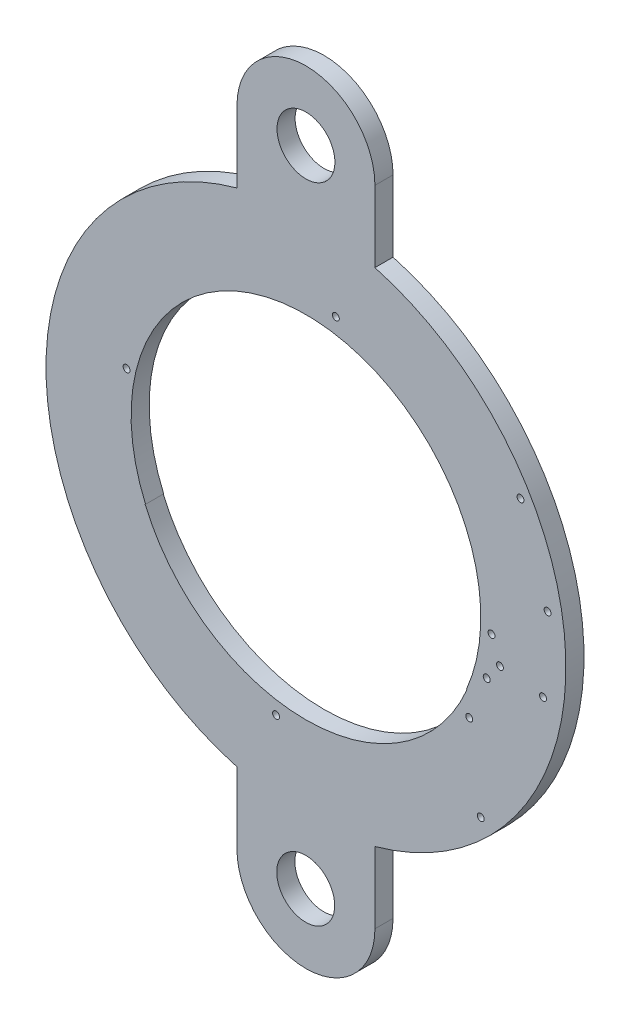
ISO-10303-21;
HEADER;
FILE_DESCRIPTION(('STEP AP214'),'2;1');
FILE_NAME('part.step','',(''),(''),'','','');
FILE_SCHEMA(('AUTOMOTIVE_DESIGN { 1 0 10303 214 1 1 1 1 }'));
ENDSEC;
DATA;
#1=APPLICATION_CONTEXT('core data for automotive mechanical design processes');
#2=APPLICATION_PROTOCOL_DEFINITION('international standard','automotive_design',2000,#1);
#3=PRODUCT_CONTEXT('',#1,'mechanical');
#4=PRODUCT('Part','Part','',(#3));
#5=PRODUCT_RELATED_PRODUCT_CATEGORY('part','',(#4));
#6=PRODUCT_DEFINITION_FORMATION('','',#4);
#7=PRODUCT_DEFINITION_CONTEXT('part definition',#1,'design');
#8=PRODUCT_DEFINITION('design','',#6,#7);
#9=PRODUCT_DEFINITION_SHAPE('','',#8);
#10=(LENGTH_UNIT() NAMED_UNIT(*) SI_UNIT(.MILLI.,.METRE.));
#11=(NAMED_UNIT(*) PLANE_ANGLE_UNIT() SI_UNIT($,.RADIAN.));
#12=(NAMED_UNIT(*) SI_UNIT($,.STERADIAN.) SOLID_ANGLE_UNIT());
#13=UNCERTAINTY_MEASURE_WITH_UNIT(LENGTH_MEASURE(1.E-05),#10,'distance_accuracy_value','');
#14=(GEOMETRIC_REPRESENTATION_CONTEXT(3) GLOBAL_UNCERTAINTY_ASSIGNED_CONTEXT((#13)) GLOBAL_UNIT_ASSIGNED_CONTEXT((#10,
#11,#12)) REPRESENTATION_CONTEXT('',''));
#15=CARTESIAN_POINT('',(0.,0.,0.));
#16=DIRECTION('',(0.,0.,1.));
#17=DIRECTION('',(1.,0.,0.));
#18=AXIS2_PLACEMENT_3D('',#15,#16,#17);
#19=CARTESIAN_POINT('',(0.,17.74358112,-0.285));
#20=DIRECTION('',(0.,0.,1.));
#21=DIRECTION('',(1.,0.,0.));
#22=AXIS2_PLACEMENT_3D('',#19,#20,#21);
#23=CYLINDRICAL_SURFACE('',#22,1.6);
#24=CARTESIAN_POINT('',(0.,17.74358112,1.));
#25=DIRECTION('',(0.,0.,-1.));
#26=DIRECTION('',(1.,0.,0.));
#27=AXIS2_PLACEMENT_3D('',#24,#25,#26);
#28=CIRCLE('',#27,1.6);
#29=CARTESIAN_POINT('',(1.6,17.74358112,1.));
#30=VERTEX_POINT('',#29);
#31=EDGE_CURVE('E625',#30,#30,#28,.T.);
#32=ORIENTED_EDGE('',*,*,#31,.F.);
#33=EDGE_LOOP('',(#32));
#34=FACE_BOUND('',#33,.T.);
#35=CARTESIAN_POINT('',(0.,17.74358112,0.));
#36=DIRECTION('',(0.,0.,1.));
#37=DIRECTION('',(1.,0.,0.));
#38=AXIS2_PLACEMENT_3D('',#35,#36,#37);
#39=CIRCLE('',#38,1.6);
#40=CARTESIAN_POINT('',(1.6,17.74358112,0.));
#41=VERTEX_POINT('',#40);
#42=EDGE_CURVE('E460',#41,#41,#39,.T.);
#43=ORIENTED_EDGE('',*,*,#42,.F.);
#44=EDGE_LOOP('',(#43));
#45=FACE_BOUND('',#44,.T.);
#46=ADVANCED_FACE('F331',(#34,#45),#23,.F.);
#47=CARTESIAN_POINT('',(10.715,-1.80141888,-0.285));
#48=DIRECTION('',(0.,0.,1.));
#49=DIRECTION('',(1.,0.,0.));
#50=AXIS2_PLACEMENT_3D('',#47,#48,#49);
#51=CYLINDRICAL_SURFACE('',#50,0.1905);
#52=CARTESIAN_POINT('',(10.715,-1.80141888,1.));
#53=DIRECTION('',(0.,0.,-1.));
#54=DIRECTION('',(1.,0.,0.));
#55=AXIS2_PLACEMENT_3D('',#52,#53,#54);
#56=CIRCLE('',#55,0.1905);
#57=CARTESIAN_POINT('',(10.9055,-1.80141888,1.));
#58=VERTEX_POINT('',#57);
#59=EDGE_CURVE('E615',#58,#58,#56,.T.);
#60=ORIENTED_EDGE('',*,*,#59,.F.);
#61=EDGE_LOOP('',(#60));
#62=FACE_BOUND('',#61,.T.);
#63=CARTESIAN_POINT('',(10.715,-1.80141888,0.));
#64=DIRECTION('',(0.,0.,1.));
#65=DIRECTION('',(1.,0.,0.));
#66=AXIS2_PLACEMENT_3D('',#63,#64,#65);
#67=CIRCLE('',#66,0.1905);
#68=CARTESIAN_POINT('',(10.9055,-1.80141888,0.));
#69=VERTEX_POINT('',#68);
#70=EDGE_CURVE('E464',#69,#69,#67,.T.);
#71=ORIENTED_EDGE('',*,*,#70,.F.);
#72=EDGE_LOOP('',(#71));
#73=FACE_BOUND('',#72,.T.);
#74=ADVANCED_FACE('F673',(#62,#73),#51,.F.);
#75=CARTESIAN_POINT('',(11.849,6.78358112,-0.285));
#76=DIRECTION('',(0.,0.,1.));
#77=DIRECTION('',(1.,0.,0.));
#78=AXIS2_PLACEMENT_3D('',#75,#76,#77);
#79=CYLINDRICAL_SURFACE('',#78,0.1905);
#80=CARTESIAN_POINT('',(11.849,6.78358112,1.));
#81=DIRECTION('',(0.,0.,-1.));
#82=DIRECTION('',(1.,0.,0.));
#83=AXIS2_PLACEMENT_3D('',#80,#81,#82);
#84=CIRCLE('',#83,0.1905);
#85=CARTESIAN_POINT('',(12.0395,6.78358112,1.));
#86=VERTEX_POINT('',#85);
#87=EDGE_CURVE('E605',#86,#86,#84,.T.);
#88=ORIENTED_EDGE('',*,*,#87,.F.);
#89=EDGE_LOOP('',(#88));
#90=FACE_BOUND('',#89,.T.);
#91=CARTESIAN_POINT('',(11.849,6.78358112,0.));
#92=DIRECTION('',(0.,0.,1.));
#93=DIRECTION('',(1.,0.,0.));
#94=AXIS2_PLACEMENT_3D('',#91,#92,#93);
#95=CIRCLE('',#94,0.1905);
#96=CARTESIAN_POINT('',(12.0395,6.78358112,0.));
#97=VERTEX_POINT('',#96);
#98=EDGE_CURVE('E610',#97,#97,#95,.T.);
#99=ORIENTED_EDGE('',*,*,#98,.F.);
#100=EDGE_LOOP('',(#99));
#101=FACE_BOUND('',#100,.T.);
#102=ADVANCED_FACE('F679',(#90,#101),#79,.F.);
#103=CARTESIAN_POINT('',(13.346,2.12458112,-0.285));
#104=DIRECTION('',(0.,0.,1.));
#105=DIRECTION('',(1.,0.,0.));
#106=AXIS2_PLACEMENT_3D('',#103,#104,#105);
#107=CYLINDRICAL_SURFACE('',#106,0.1905);
#108=CARTESIAN_POINT('',(13.346,2.12458112,1.));
#109=DIRECTION('',(0.,0.,-1.));
#110=DIRECTION('',(1.,0.,0.));
#111=AXIS2_PLACEMENT_3D('',#108,#109,#110);
#112=CIRCLE('',#111,0.1905);
#113=CARTESIAN_POINT('',(13.5365,2.12458112,1.));
#114=VERTEX_POINT('',#113);
#115=EDGE_CURVE('E594',#114,#114,#112,.T.);
#116=ORIENTED_EDGE('',*,*,#115,.F.);
#117=EDGE_LOOP('',(#116));
#118=FACE_BOUND('',#117,.T.);
#119=CARTESIAN_POINT('',(13.346,2.12458112,0.));
#120=DIRECTION('',(0.,0.,1.));
#121=DIRECTION('',(1.,0.,0.));
#122=AXIS2_PLACEMENT_3D('',#119,#120,#121);
#123=CIRCLE('',#122,0.1905);
#124=CARTESIAN_POINT('',(13.5365,2.12458112,0.));
#125=VERTEX_POINT('',#124);
#126=EDGE_CURVE('E599',#125,#125,#123,.T.);
#127=ORIENTED_EDGE('',*,*,#126,.F.);
#128=EDGE_LOOP('',(#127));
#129=FACE_BOUND('',#128,.T.);
#130=ADVANCED_FACE('F687',(#118,#129),#107,.F.);
#131=CARTESIAN_POINT('',(9.017,-5.11641888,-0.285));
#132=DIRECTION('',(0.,0.,1.));
#133=DIRECTION('',(1.,0.,0.));
#134=AXIS2_PLACEMENT_3D('',#131,#132,#133);
#135=CYLINDRICAL_SURFACE('',#134,0.1905);
#136=CARTESIAN_POINT('',(9.017,-5.11641888,1.));
#137=DIRECTION('',(0.,0.,-1.));
#138=DIRECTION('',(1.,0.,0.));
#139=AXIS2_PLACEMENT_3D('',#136,#137,#138);
#140=CIRCLE('',#139,0.1905);
#141=CARTESIAN_POINT('',(9.2075,-5.11641888,1.));
#142=VERTEX_POINT('',#141);
#143=EDGE_CURVE('E583',#142,#142,#140,.T.);
#144=ORIENTED_EDGE('',*,*,#143,.F.);
#145=EDGE_LOOP('',(#144));
#146=FACE_BOUND('',#145,.T.);
#147=CARTESIAN_POINT('',(9.017,-5.11641888,0.));
#148=DIRECTION('',(0.,0.,1.));
#149=DIRECTION('',(1.,0.,0.));
#150=AXIS2_PLACEMENT_3D('',#147,#148,#149);
#151=CIRCLE('',#150,0.1905);
#152=CARTESIAN_POINT('',(9.2075,-5.11641888,0.));
#153=VERTEX_POINT('',#152);
#154=EDGE_CURVE('E589',#153,#153,#151,.T.);
#155=ORIENTED_EDGE('',*,*,#154,.F.);
#156=EDGE_LOOP('',(#155));
#157=FACE_BOUND('',#156,.T.);
#158=ADVANCED_FACE('F691',(#146,#157),#135,.F.);
#159=CARTESIAN_POINT('',(-9.906,2.12258112,-0.285));
#160=DIRECTION('',(0.,0.,1.));
#161=DIRECTION('',(1.,0.,0.));
#162=AXIS2_PLACEMENT_3D('',#159,#160,#161);
#163=CYLINDRICAL_SURFACE('',#162,0.1905);
#164=CARTESIAN_POINT('',(-9.906,2.12258112,1.));
#165=DIRECTION('',(0.,0.,-1.));
#166=DIRECTION('',(1.,0.,0.));
#167=AXIS2_PLACEMENT_3D('',#164,#165,#166);
#168=CIRCLE('',#167,0.1905);
#169=CARTESIAN_POINT('',(-9.7155,2.12258112,1.));
#170=VERTEX_POINT('',#169);
#171=EDGE_CURVE('E572',#170,#170,#168,.T.);
#172=ORIENTED_EDGE('',*,*,#171,.F.);
#173=EDGE_LOOP('',(#172));
#174=FACE_BOUND('',#173,.T.);
#175=CARTESIAN_POINT('',(-9.906,2.12258112,0.));
#176=DIRECTION('',(0.,0.,1.));
#177=DIRECTION('',(1.,0.,0.));
#178=AXIS2_PLACEMENT_3D('',#175,#176,#177);
#179=CIRCLE('',#178,0.1905);
#180=CARTESIAN_POINT('',(-9.7155,2.12258112,0.));
#181=VERTEX_POINT('',#180);
#182=EDGE_CURVE('E577',#181,#181,#179,.T.);
#183=ORIENTED_EDGE('',*,*,#182,.F.);
#184=EDGE_LOOP('',(#183));
#185=FACE_BOUND('',#184,.T.);
#186=ADVANCED_FACE('F695',(#174,#185),#163,.F.);
#187=CARTESIAN_POINT('',(-1.651,-10.32341888,-0.285));
#188=DIRECTION('',(0.,0.,1.));
#189=DIRECTION('',(1.,0.,0.));
#190=AXIS2_PLACEMENT_3D('',#187,#188,#189);
#191=CYLINDRICAL_SURFACE('',#190,0.1905);
#192=CARTESIAN_POINT('',(-1.651,-10.32341888,1.));
#193=DIRECTION('',(0.,0.,-1.));
#194=DIRECTION('',(1.,0.,0.));
#195=AXIS2_PLACEMENT_3D('',#192,#193,#194);
#196=CIRCLE('',#195,0.1905);
#197=CARTESIAN_POINT('',(-1.4605,-10.32341888,1.));
#198=VERTEX_POINT('',#197);
#199=EDGE_CURVE('E562',#198,#198,#196,.T.);
#200=ORIENTED_EDGE('',*,*,#199,.F.);
#201=EDGE_LOOP('',(#200));
#202=FACE_BOUND('',#201,.T.);
#203=CARTESIAN_POINT('',(-1.651,-10.32341888,0.));
#204=DIRECTION('',(0.,0.,1.));
#205=DIRECTION('',(1.,0.,0.));
#206=AXIS2_PLACEMENT_3D('',#203,#204,#205);
#207=CIRCLE('',#206,0.1905);
#208=CARTESIAN_POINT('',(-1.4605,-10.32341888,0.));
#209=VERTEX_POINT('',#208);
#210=EDGE_CURVE('E567',#209,#209,#207,.T.);
#211=ORIENTED_EDGE('',*,*,#210,.F.);
#212=EDGE_LOOP('',(#211));
#213=FACE_BOUND('',#212,.T.);
#214=ADVANCED_FACE('F699',(#202,#213),#191,.F.);
#215=CARTESIAN_POINT('',(1.651,10.37758112,-0.285));
#216=DIRECTION('',(0.,0.,1.));
#217=DIRECTION('',(1.,0.,0.));
#218=AXIS2_PLACEMENT_3D('',#215,#216,#217);
#219=CYLINDRICAL_SURFACE('',#218,0.1905);
#220=CARTESIAN_POINT('',(1.651,10.37758112,1.));
#221=DIRECTION('',(0.,0.,-1.));
#222=DIRECTION('',(1.,0.,0.));
#223=AXIS2_PLACEMENT_3D('',#220,#221,#222);
#224=CIRCLE('',#223,0.1905);
#225=CARTESIAN_POINT('',(1.8415,10.37758112,1.));
#226=VERTEX_POINT('',#225);
#227=EDGE_CURVE('E552',#226,#226,#224,.T.);
#228=ORIENTED_EDGE('',*,*,#227,.F.);
#229=EDGE_LOOP('',(#228));
#230=FACE_BOUND('',#229,.T.);
#231=CARTESIAN_POINT('',(1.651,10.37758112,0.));
#232=DIRECTION('',(0.,0.,1.));
#233=DIRECTION('',(1.,0.,0.));
#234=AXIS2_PLACEMENT_3D('',#231,#232,#233);
#235=CIRCLE('',#234,0.1905);
#236=CARTESIAN_POINT('',(1.8415,10.37758112,0.));
#237=VERTEX_POINT('',#236);
#238=EDGE_CURVE('E557',#237,#237,#235,.T.);
#239=ORIENTED_EDGE('',*,*,#238,.F.);
#240=EDGE_LOOP('',(#239));
#241=FACE_BOUND('',#240,.T.);
#242=ADVANCED_FACE('F703',(#230,#241),#219,.F.);
#243=CARTESIAN_POINT('',(9.652,-9.56141888,-0.285));
#244=DIRECTION('',(0.,0.,1.));
#245=DIRECTION('',(1.,0.,0.));
#246=AXIS2_PLACEMENT_3D('',#243,#244,#245);
#247=CYLINDRICAL_SURFACE('',#246,0.1905);
#248=CARTESIAN_POINT('',(9.652,-9.56141888,1.));
#249=DIRECTION('',(0.,0.,-1.));
#250=DIRECTION('',(1.,0.,0.));
#251=AXIS2_PLACEMENT_3D('',#248,#249,#250);
#252=CIRCLE('',#251,0.1905);
#253=CARTESIAN_POINT('',(9.8425,-9.56141888,1.));
#254=VERTEX_POINT('',#253);
#255=EDGE_CURVE('E542',#254,#254,#252,.T.);
#256=ORIENTED_EDGE('',*,*,#255,.F.);
#257=EDGE_LOOP('',(#256));
#258=FACE_BOUND('',#257,.T.);
#259=CARTESIAN_POINT('',(9.652,-9.56141888,0.));
#260=DIRECTION('',(0.,0.,1.));
#261=DIRECTION('',(1.,0.,0.));
#262=AXIS2_PLACEMENT_3D('',#259,#260,#261);
#263=CIRCLE('',#262,0.1905);
#264=CARTESIAN_POINT('',(9.8425,-9.56141888,0.));
#265=VERTEX_POINT('',#264);
#266=EDGE_CURVE('E547',#265,#265,#263,.T.);
#267=ORIENTED_EDGE('',*,*,#266,.F.);
#268=EDGE_LOOP('',(#267));
#269=FACE_BOUND('',#268,.T.);
#270=ADVANCED_FACE('F707',(#258,#269),#247,.F.);
#271=CARTESIAN_POINT('',(13.094,-2.09341888,-0.285));
#272=DIRECTION('',(0.,0.,1.));
#273=DIRECTION('',(1.,0.,0.));
#274=AXIS2_PLACEMENT_3D('',#271,#272,#273);
#275=CYLINDRICAL_SURFACE('',#274,0.1905);
#276=CARTESIAN_POINT('',(13.094,-2.09341888,1.));
#277=DIRECTION('',(0.,0.,-1.));
#278=DIRECTION('',(1.,0.,0.));
#279=AXIS2_PLACEMENT_3D('',#276,#277,#278);
#280=CIRCLE('',#279,0.1905);
#281=CARTESIAN_POINT('',(13.2845,-2.09341888,1.));
#282=VERTEX_POINT('',#281);
#283=EDGE_CURVE('E531',#282,#282,#280,.T.);
#284=ORIENTED_EDGE('',*,*,#283,.F.);
#285=EDGE_LOOP('',(#284));
#286=FACE_BOUND('',#285,.T.);
#287=CARTESIAN_POINT('',(13.094,-2.09341888,0.));
#288=DIRECTION('',(0.,0.,1.));
#289=DIRECTION('',(1.,0.,0.));
#290=AXIS2_PLACEMENT_3D('',#287,#288,#289);
#291=CIRCLE('',#290,0.1905);
#292=CARTESIAN_POINT('',(13.2845,-2.09341888,0.));
#293=VERTEX_POINT('',#292);
#294=EDGE_CURVE('E537',#293,#293,#291,.T.);
#295=ORIENTED_EDGE('',*,*,#294,.F.);
#296=EDGE_LOOP('',(#295));
#297=FACE_BOUND('',#296,.T.);
#298=ADVANCED_FACE('F711',(#286,#297),#275,.F.);
#299=CARTESIAN_POINT('',(10.249,-0.506418880000001,-0.285));
#300=DIRECTION('',(0.,0.,1.));
#301=DIRECTION('',(1.,0.,0.));
#302=AXIS2_PLACEMENT_3D('',#299,#300,#301);
#303=CYLINDRICAL_SURFACE('',#302,0.1905);
#304=CARTESIAN_POINT('',(10.249,-0.506418880000001,1.));
#305=DIRECTION('',(0.,0.,-1.));
#306=DIRECTION('',(1.,0.,0.));
#307=AXIS2_PLACEMENT_3D('',#304,#305,#306);
#308=CIRCLE('',#307,0.1905);
#309=CARTESIAN_POINT('',(10.4395,-0.506418880000001,1.));
#310=VERTEX_POINT('',#309);
#311=EDGE_CURVE('E520',#310,#310,#308,.T.);
#312=ORIENTED_EDGE('',*,*,#311,.F.);
#313=EDGE_LOOP('',(#312));
#314=FACE_BOUND('',#313,.T.);
#315=CARTESIAN_POINT('',(10.249,-0.506418880000001,0.));
#316=DIRECTION('',(0.,0.,1.));
#317=DIRECTION('',(1.,0.,0.));
#318=AXIS2_PLACEMENT_3D('',#315,#316,#317);
#319=CIRCLE('',#318,0.1905);
#320=CARTESIAN_POINT('',(10.4395,-0.506418880000001,0.));
#321=VERTEX_POINT('',#320);
#322=EDGE_CURVE('E525',#321,#321,#319,.T.);
#323=ORIENTED_EDGE('',*,*,#322,.F.);
#324=EDGE_LOOP('',(#323));
#325=FACE_BOUND('',#324,.T.);
#326=ADVANCED_FACE('F715',(#314,#325),#303,.F.);
#327=CARTESIAN_POINT('',(9.982,-2.74341888,-0.285));
#328=DIRECTION('',(0.,0.,1.));
#329=DIRECTION('',(1.,0.,0.));
#330=AXIS2_PLACEMENT_3D('',#327,#328,#329);
#331=CYLINDRICAL_SURFACE('',#330,0.1905);
#332=CARTESIAN_POINT('',(9.982,-2.74341888,1.));
#333=DIRECTION('',(0.,0.,-1.));
#334=DIRECTION('',(1.,0.,0.));
#335=AXIS2_PLACEMENT_3D('',#332,#333,#334);
#336=CIRCLE('',#335,0.1905);
#337=CARTESIAN_POINT('',(10.1725,-2.74341888,1.));
#338=VERTEX_POINT('',#337);
#339=EDGE_CURVE('E509',#338,#338,#336,.T.);
#340=ORIENTED_EDGE('',*,*,#339,.F.);
#341=EDGE_LOOP('',(#340));
#342=FACE_BOUND('',#341,.T.);
#343=CARTESIAN_POINT('',(9.982,-2.74341888,0.));
#344=DIRECTION('',(0.,0.,1.));
#345=DIRECTION('',(1.,0.,0.));
#346=AXIS2_PLACEMENT_3D('',#343,#344,#345);
#347=CIRCLE('',#346,0.1905);
#348=CARTESIAN_POINT('',(10.1725,-2.74341888,0.));
#349=VERTEX_POINT('',#348);
#350=EDGE_CURVE('E515',#349,#349,#347,.T.);
#351=ORIENTED_EDGE('',*,*,#350,.F.);
#352=EDGE_LOOP('',(#351));
#353=FACE_BOUND('',#352,.T.);
#354=ADVANCED_FACE('F719',(#342,#353),#331,.F.);
#355=CARTESIAN_POINT('',(-0.0129999999999991,-17.81641888,-0.285));
#356=DIRECTION('',(0.,0.,1.));
#357=DIRECTION('',(1.,0.,0.));
#358=AXIS2_PLACEMENT_3D('',#355,#356,#357);
#359=CYLINDRICAL_SURFACE('',#358,1.6);
#360=CARTESIAN_POINT('',(-0.0129999999999991,-17.81641888,1.));
#361=DIRECTION('',(0.,0.,-1.));
#362=DIRECTION('',(1.,0.,0.));
#363=AXIS2_PLACEMENT_3D('',#360,#361,#362);
#364=CIRCLE('',#363,1.6);
#365=CARTESIAN_POINT('',(1.587,-17.81641888,1.));
#366=VERTEX_POINT('',#365);
#367=EDGE_CURVE('E500',#366,#366,#364,.T.);
#368=ORIENTED_EDGE('',*,*,#367,.F.);
#369=EDGE_LOOP('',(#368));
#370=FACE_BOUND('',#369,.T.);
#371=CARTESIAN_POINT('',(-0.0129999999999991,-17.81641888,0.));
#372=DIRECTION('',(0.,0.,1.));
#373=DIRECTION('',(1.,0.,0.));
#374=AXIS2_PLACEMENT_3D('',#371,#372,#373);
#375=CIRCLE('',#374,1.6);
#376=CARTESIAN_POINT('',(1.587,-17.81641888,0.));
#377=VERTEX_POINT('',#376);
#378=EDGE_CURVE('E512',#377,#377,#375,.T.);
#379=ORIENTED_EDGE('',*,*,#378,.F.);
#380=EDGE_LOOP('',(#379));
#381=FACE_BOUND('',#380,.T.);
#382=ADVANCED_FACE('F723',(#370,#381),#359,.F.);
#383=CARTESIAN_POINT('',(0.,3.89660179123119E-09,-0.285));
#384=DIRECTION('',(0.,0.,1.));
#385=DIRECTION('',(0.920504853452441,0.390731128489273,0.));
#386=AXIS2_PLACEMENT_3D('',#383,#384,#385);
#387=CYLINDRICAL_SURFACE('',#386,9.65774375513308);
#388=CARTESIAN_POINT('',(0.,3.89660179123119E-09,0.));
#389=DIRECTION('',(0.,0.,-1.));
#390=DIRECTION('',(0.920504853452441,0.390731128489273,0.));
#391=AXIS2_PLACEMENT_3D('',#388,#389,#390);
#392=CIRCLE('',#391,9.65774375513308);
#393=CARTESIAN_POINT('',(-8.85872881453179,-3.84641888,0.));
#394=VERTEX_POINT('',#393);
#395=CARTESIAN_POINT('',(8.85872881453179,-3.84641888,0.));
#396=VERTEX_POINT('',#395);
#397=EDGE_CURVE('E13',#394,#396,#392,.T.);
#398=ORIENTED_EDGE('',*,*,#397,.T.);
#399=DIRECTION('',(0.,0.,1.));
#400=VECTOR('',#399,1.);
#401=CARTESIAN_POINT('',(8.85872881453178,-3.84641888000001,0.499999999999999));
#402=LINE('',#401,#400);
#403=CARTESIAN_POINT('',(8.85872881453179,-3.84641888,1.));
#404=VERTEX_POINT('',#403);
#405=EDGE_CURVE('E481',#396,#404,#402,.T.);
#406=ORIENTED_EDGE('',*,*,#405,.T.);
#407=CARTESIAN_POINT('',(0.,3.89660179123119E-09,1.));
#408=DIRECTION('',(0.,0.,-1.));
#409=DIRECTION('',(0.920504853452441,0.390731128489273,0.));
#410=AXIS2_PLACEMENT_3D('',#407,#408,#409);
#411=CIRCLE('',#410,9.65774375513308);
#412=CARTESIAN_POINT('',(-8.85872881453179,-3.84641888,1.));
#413=VERTEX_POINT('',#412);
#414=EDGE_CURVE('E350',#413,#404,#411,.T.);
#415=ORIENTED_EDGE('',*,*,#414,.F.);
#416=DIRECTION('',(0.,0.,-1.));
#417=VECTOR('',#416,1.);
#418=CARTESIAN_POINT('',(-8.85872881453179,-3.84641888000001,0.499999999999999));
#419=LINE('',#418,#417);
#420=EDGE_CURVE('E342',#413,#394,#419,.T.);
#421=ORIENTED_EDGE('',*,*,#420,.T.);
#422=EDGE_LOOP('',(#398,#406,#415,#421));
#423=FACE_BOUND('',#422,.T.);
#424=ADVANCED_FACE('F655',(#423),#387,.F.);
#425=CARTESIAN_POINT('',(0.,-0.0364188799999998,0.));
#426=DIRECTION('',(0.,0.,1.));
#427=DIRECTION('',(1.,0.,0.));
#428=AXIS2_PLACEMENT_3D('',#425,#426,#427);
#429=PLANE('',#428);
#430=ORIENTED_EDGE('',*,*,#397,.F.);
#431=DIRECTION('',(1.,0.,0.));
#432=VECTOR('',#431,1.);
#433=CARTESIAN_POINT('',(-8.89,-3.84641888,0.));
#434=LINE('',#433,#432);
#435=CARTESIAN_POINT('',(-8.89,-3.84641888,0.));
#436=VERTEX_POINT('',#435);
#437=EDGE_CURVE('E479',#436,#394,#434,.T.);
#438=ORIENTED_EDGE('',*,*,#437,.F.);
#439=CARTESIAN_POINT('',(0.,-0.0728377638966014,0.));
#440=DIRECTION('',(0.,0.,-1.));
#441=DIRECTION('',(-0.920504853452441,-0.390731128489273,0.));
#442=AXIS2_PLACEMENT_3D('',#439,#440,#441);
#443=CIRCLE('',#442,9.65774375513308);
#444=CARTESIAN_POINT('',(8.89,-3.84641888,0.));
#445=VERTEX_POINT('',#444);
#446=EDGE_CURVE('E503',#445,#436,#443,.T.);
#447=ORIENTED_EDGE('',*,*,#446,.F.);
#448=DIRECTION('',(1.,0.,0.));
#449=VECTOR('',#448,1.);
#450=CARTESIAN_POINT('',(6.35,-3.84641888,0.));
#451=LINE('',#450,#449);
#452=EDGE_CURVE('E495',#396,#445,#451,.T.);
#453=ORIENTED_EDGE('',*,*,#452,.F.);
#454=EDGE_LOOP('',(#430,#438,#447,#453));
#455=FACE_BOUND('',#454,.T.);
#456=ORIENTED_EDGE('',*,*,#378,.T.);
#457=EDGE_LOOP('',(#456));
#458=FACE_BOUND('',#457,.T.);
#459=ORIENTED_EDGE('',*,*,#350,.T.);
#460=EDGE_LOOP('',(#459));
#461=FACE_BOUND('',#460,.T.);
#462=ORIENTED_EDGE('',*,*,#322,.T.);
#463=EDGE_LOOP('',(#462));
#464=FACE_BOUND('',#463,.T.);
#465=ORIENTED_EDGE('',*,*,#294,.T.);
#466=EDGE_LOOP('',(#465));
#467=FACE_BOUND('',#466,.T.);
#468=ORIENTED_EDGE('',*,*,#266,.T.);
#469=EDGE_LOOP('',(#468));
#470=FACE_BOUND('',#469,.T.);
#471=ORIENTED_EDGE('',*,*,#238,.T.);
#472=EDGE_LOOP('',(#471));
#473=FACE_BOUND('',#472,.T.);
#474=ORIENTED_EDGE('',*,*,#210,.T.);
#475=EDGE_LOOP('',(#474));
#476=FACE_BOUND('',#475,.T.);
#477=ORIENTED_EDGE('',*,*,#182,.T.);
#478=EDGE_LOOP('',(#477));
#479=FACE_BOUND('',#478,.T.);
#480=ORIENTED_EDGE('',*,*,#154,.T.);
#481=EDGE_LOOP('',(#480));
#482=FACE_BOUND('',#481,.T.);
#483=ORIENTED_EDGE('',*,*,#126,.T.);
#484=EDGE_LOOP('',(#483));
#485=FACE_BOUND('',#484,.T.);
#486=ORIENTED_EDGE('',*,*,#98,.T.);
#487=EDGE_LOOP('',(#486));
#488=FACE_BOUND('',#487,.T.);
#489=ORIENTED_EDGE('',*,*,#70,.T.);
#490=EDGE_LOOP('',(#489));
#491=FACE_BOUND('',#490,.T.);
#492=ORIENTED_EDGE('',*,*,#42,.T.);
#493=EDGE_LOOP('',(#492));
#494=FACE_BOUND('',#493,.T.);
#495=CARTESIAN_POINT('',(0.,-17.81641888,0.));
#496=DIRECTION('',(0.,0.,1.));
#497=DIRECTION('',(-1.,0.,0.));
#498=AXIS2_PLACEMENT_3D('',#495,#496,#497);
#499=CIRCLE('',#498,3.81);
#500=CARTESIAN_POINT('',(-3.81,-17.81641888,0.));
#501=VERTEX_POINT('',#500);
#502=CARTESIAN_POINT('',(3.81,-17.81641888,0.));
#503=VERTEX_POINT('',#502);
#504=EDGE_CURVE('E459',#501,#503,#499,.T.);
#505=ORIENTED_EDGE('',*,*,#504,.F.);
#506=DIRECTION('',(0.,1.,0.));
#507=VECTOR('',#506,1.);
#508=CARTESIAN_POINT('',(-3.81,-17.81641888,0.));
#509=LINE('',#508,#507);
#510=CARTESIAN_POINT('',(-3.81,-13.87941888,0.));
#511=VERTEX_POINT('',#510);
#512=EDGE_CURVE('E439',#501,#511,#509,.T.);
#513=ORIENTED_EDGE('',*,*,#512,.T.);
#514=CARTESIAN_POINT('',(8.36052030037115E-06,-0.0364188799999998,0.));
#515=DIRECTION('',(0.,0.,1.));
#516=DIRECTION('',(-0.265362605789323,0.964148685343034,0.));
#517=AXIS2_PLACEMENT_3D('',#514,#515,#516);
#518=CIRCLE('',#517,14.3577439978304);
#519=CARTESIAN_POINT('',(-3.81,13.80658112,0.));
#520=VERTEX_POINT('',#519);
#521=EDGE_CURVE('E444',#520,#511,#518,.T.);
#522=ORIENTED_EDGE('',*,*,#521,.F.);
#523=DIRECTION('',(0.,1.,0.));
#524=VECTOR('',#523,1.);
#525=CARTESIAN_POINT('',(-3.81,13.80658112,0.));
#526=LINE('',#525,#524);
#527=CARTESIAN_POINT('',(-3.81,17.74358112,0.));
#528=VERTEX_POINT('',#527);
#529=EDGE_CURVE('E461',#520,#528,#526,.T.);
#530=ORIENTED_EDGE('',*,*,#529,.T.);
#531=CARTESIAN_POINT('',(0.,17.74358112,0.));
#532=DIRECTION('',(0.,0.,1.));
#533=DIRECTION('',(1.,0.,0.));
#534=AXIS2_PLACEMENT_3D('',#531,#532,#533);
#535=CIRCLE('',#534,3.81);
#536=CARTESIAN_POINT('',(3.81,17.74358112,0.));
#537=VERTEX_POINT('',#536);
#538=EDGE_CURVE('E650',#537,#528,#535,.T.);
#539=ORIENTED_EDGE('',*,*,#538,.F.);
#540=DIRECTION('',(0.,-1.,0.));
#541=VECTOR('',#540,1.);
#542=CARTESIAN_POINT('',(3.81,17.74358112,0.));
#543=LINE('',#542,#541);
#544=CARTESIAN_POINT('',(3.81,13.80658112,0.));
#545=VERTEX_POINT('',#544);
#546=EDGE_CURVE('E466',#537,#545,#543,.T.);
#547=ORIENTED_EDGE('',*,*,#546,.T.);
#548=CARTESIAN_POINT('',(-8.36052030037115E-06,-0.0364188799999998,0.));
#549=DIRECTION('',(0.,0.,1.));
#550=DIRECTION('',(0.265362605789324,-0.964148685343033,0.));
#551=AXIS2_PLACEMENT_3D('',#548,#549,#550);
#552=CIRCLE('',#551,14.3577439978304);
#553=CARTESIAN_POINT('',(3.81,-13.87941888,0.));
#554=VERTEX_POINT('',#553);
#555=EDGE_CURVE('E645',#554,#545,#552,.T.);
#556=ORIENTED_EDGE('',*,*,#555,.F.);
#557=DIRECTION('',(0.,-1.,0.));
#558=VECTOR('',#557,1.);
#559=CARTESIAN_POINT('',(3.81,-13.87941888,0.));
#560=LINE('',#559,#558);
#561=EDGE_CURVE('E476',#554,#503,#560,.T.);
#562=ORIENTED_EDGE('',*,*,#561,.T.);
#563=EDGE_LOOP('',(#505,#513,#522,#530,#539,#547,#556,#562));
#564=FACE_BOUND('',#563,.T.);
#565=ADVANCED_FACE('F456',(#455,#458,#461,#464,#467,#470,#473,#476,#479,#482,#485,#488,#491,
#494,#564),#429,.F.);
#566=CARTESIAN_POINT('',(0.,-0.0364188799999998,1.));
#567=DIRECTION('',(0.,0.,1.));
#568=DIRECTION('',(1.,0.,0.));
#569=AXIS2_PLACEMENT_3D('',#566,#567,#568);
#570=PLANE('',#569);
#571=DIRECTION('',(1.,0.,0.));
#572=VECTOR('',#571,1.);
#573=CARTESIAN_POINT('',(-8.89,-3.84641888,1.));
#574=LINE('',#573,#572);
#575=CARTESIAN_POINT('',(-8.89,-3.84641888,1.));
#576=VERTEX_POINT('',#575);
#577=EDGE_CURVE('E474',#576,#413,#574,.T.);
#578=ORIENTED_EDGE('',*,*,#577,.T.);
#579=ORIENTED_EDGE('',*,*,#414,.T.);
#580=DIRECTION('',(1.,0.,0.));
#581=VECTOR('',#580,1.);
#582=CARTESIAN_POINT('',(6.35,-3.84641888,1.));
#583=LINE('',#582,#581);
#584=CARTESIAN_POINT('',(8.89,-3.84641888,1.));
#585=VERTEX_POINT('',#584);
#586=EDGE_CURVE('E486',#404,#585,#583,.T.);
#587=ORIENTED_EDGE('',*,*,#586,.T.);
#588=CARTESIAN_POINT('',(0.,-0.0728377638966014,1.));
#589=DIRECTION('',(0.,0.,-1.));
#590=DIRECTION('',(-0.920504853452441,-0.390731128489273,0.));
#591=AXIS2_PLACEMENT_3D('',#588,#589,#590);
#592=CIRCLE('',#591,9.65774375513308);
#593=EDGE_CURVE('E492',#585,#576,#592,.T.);
#594=ORIENTED_EDGE('',*,*,#593,.T.);
#595=EDGE_LOOP('',(#578,#579,#587,#594));
#596=FACE_BOUND('',#595,.T.);
#597=ORIENTED_EDGE('',*,*,#367,.T.);
#598=EDGE_LOOP('',(#597));
#599=FACE_BOUND('',#598,.T.);
#600=ORIENTED_EDGE('',*,*,#339,.T.);
#601=EDGE_LOOP('',(#600));
#602=FACE_BOUND('',#601,.T.);
#603=ORIENTED_EDGE('',*,*,#311,.T.);
#604=EDGE_LOOP('',(#603));
#605=FACE_BOUND('',#604,.T.);
#606=ORIENTED_EDGE('',*,*,#283,.T.);
#607=EDGE_LOOP('',(#606));
#608=FACE_BOUND('',#607,.T.);
#609=ORIENTED_EDGE('',*,*,#255,.T.);
#610=EDGE_LOOP('',(#609));
#611=FACE_BOUND('',#610,.T.);
#612=ORIENTED_EDGE('',*,*,#227,.T.);
#613=EDGE_LOOP('',(#612));
#614=FACE_BOUND('',#613,.T.);
#615=ORIENTED_EDGE('',*,*,#199,.T.);
#616=EDGE_LOOP('',(#615));
#617=FACE_BOUND('',#616,.T.);
#618=ORIENTED_EDGE('',*,*,#171,.T.);
#619=EDGE_LOOP('',(#618));
#620=FACE_BOUND('',#619,.T.);
#621=ORIENTED_EDGE('',*,*,#143,.T.);
#622=EDGE_LOOP('',(#621));
#623=FACE_BOUND('',#622,.T.);
#624=ORIENTED_EDGE('',*,*,#115,.T.);
#625=EDGE_LOOP('',(#624));
#626=FACE_BOUND('',#625,.T.);
#627=ORIENTED_EDGE('',*,*,#87,.T.);
#628=EDGE_LOOP('',(#627));
#629=FACE_BOUND('',#628,.T.);
#630=ORIENTED_EDGE('',*,*,#59,.T.);
#631=EDGE_LOOP('',(#630));
#632=FACE_BOUND('',#631,.T.);
#633=ORIENTED_EDGE('',*,*,#31,.T.);
#634=EDGE_LOOP('',(#633));
#635=FACE_BOUND('',#634,.T.);
#636=CARTESIAN_POINT('',(0.,-17.81641888,1.));
#637=DIRECTION('',(0.,0.,1.));
#638=DIRECTION('',(-1.,0.,0.));
#639=AXIS2_PLACEMENT_3D('',#636,#637,#638);
#640=CIRCLE('',#639,3.81);
#641=CARTESIAN_POINT('',(-3.81,-17.81641888,1.));
#642=VERTEX_POINT('',#641);
#643=CARTESIAN_POINT('',(3.81,-17.81641888,1.));
#644=VERTEX_POINT('',#643);
#645=EDGE_CURVE('E635',#642,#644,#640,.T.);
#646=ORIENTED_EDGE('',*,*,#645,.T.);
#647=DIRECTION('',(0.,1.,0.));
#648=VECTOR('',#647,1.);
#649=CARTESIAN_POINT('',(3.81,-13.87941888,1.));
#650=LINE('',#649,#648);
#651=CARTESIAN_POINT('',(3.81,-13.87941888,1.));
#652=VERTEX_POINT('',#651);
#653=EDGE_CURVE('E1017',#644,#652,#650,.T.);
#654=ORIENTED_EDGE('',*,*,#653,.T.);
#655=CARTESIAN_POINT('',(-8.36052030037115E-06,-0.0364188799999998,1.));
#656=DIRECTION('',(0.,0.,1.));
#657=DIRECTION('',(0.265362605789324,-0.964148685343033,0.));
#658=AXIS2_PLACEMENT_3D('',#655,#656,#657);
#659=CIRCLE('',#658,14.3577439978304);
#660=CARTESIAN_POINT('',(3.81,13.80658112,1.));
#661=VERTEX_POINT('',#660);
#662=EDGE_CURVE('E1020',#652,#661,#659,.T.);
#663=ORIENTED_EDGE('',*,*,#662,.T.);
#664=DIRECTION('',(0.,1.,0.));
#665=VECTOR('',#664,1.);
#666=CARTESIAN_POINT('',(3.81,17.74358112,1.));
#667=LINE('',#666,#665);
#668=CARTESIAN_POINT('',(3.81,17.74358112,1.));
#669=VERTEX_POINT('',#668);
#670=EDGE_CURVE('E1029',#661,#669,#667,.T.);
#671=ORIENTED_EDGE('',*,*,#670,.T.);
#672=CARTESIAN_POINT('',(0.,17.74358112,1.));
#673=DIRECTION('',(0.,0.,1.));
#674=DIRECTION('',(1.,0.,0.));
#675=AXIS2_PLACEMENT_3D('',#672,#673,#674);
#676=CIRCLE('',#675,3.81);
#677=CARTESIAN_POINT('',(-3.81,17.74358112,1.));
#678=VERTEX_POINT('',#677);
#679=EDGE_CURVE('E996',#669,#678,#676,.T.);
#680=ORIENTED_EDGE('',*,*,#679,.T.);
#681=DIRECTION('',(0.,-1.,0.));
#682=VECTOR('',#681,1.);
#683=CARTESIAN_POINT('',(-3.81,13.80658112,1.));
#684=LINE('',#683,#682);
#685=CARTESIAN_POINT('',(-3.81,13.80658112,1.));
#686=VERTEX_POINT('',#685);
#687=EDGE_CURVE('E994',#678,#686,#684,.T.);
#688=ORIENTED_EDGE('',*,*,#687,.T.);
#689=CARTESIAN_POINT('',(8.36052030037115E-06,-0.0364188799999998,1.));
#690=DIRECTION('',(0.,0.,1.));
#691=DIRECTION('',(-0.265362605789323,0.964148685343034,0.));
#692=AXIS2_PLACEMENT_3D('',#689,#690,#691);
#693=CIRCLE('',#692,14.3577439978304);
#694=CARTESIAN_POINT('',(-3.81,-13.87941888,1.));
#695=VERTEX_POINT('',#694);
#696=EDGE_CURVE('E997',#686,#695,#693,.T.);
#697=ORIENTED_EDGE('',*,*,#696,.T.);
#698=DIRECTION('',(0.,-1.,0.));
#699=VECTOR('',#698,1.);
#700=CARTESIAN_POINT('',(-3.81,-17.81641888,1.));
#701=LINE('',#700,#699);
#702=EDGE_CURVE('E440',#695,#642,#701,.T.);
#703=ORIENTED_EDGE('',*,*,#702,.T.);
#704=EDGE_LOOP('',(#646,#654,#663,#671,#680,#688,#697,#703));
#705=FACE_BOUND('',#704,.T.);
#706=ADVANCED_FACE('F658',(#596,#599,#602,#605,#608,#611,#614,#617,#620,#623,#626,#629,#632,
#635,#705),#570,.T.);
#707=CARTESIAN_POINT('',(0.,-17.81641888,-0.285));
#708=DIRECTION('',(0.,0.,1.));
#709=DIRECTION('',(-1.,0.,0.));
#710=AXIS2_PLACEMENT_3D('',#707,#708,#709);
#711=CYLINDRICAL_SURFACE('',#710,3.81);
#712=ORIENTED_EDGE('',*,*,#504,.T.);
#713=DIRECTION('',(-1.56125112837912E-13,0.,1.));
#714=VECTOR('',#713,1.);
#715=CARTESIAN_POINT('',(3.80999999999998,-17.81641888,0.5));
#716=LINE('',#715,#714);
#717=EDGE_CURVE('E641',#503,#644,#716,.T.);
#718=ORIENTED_EDGE('',*,*,#717,.T.);
#719=ORIENTED_EDGE('',*,*,#645,.F.);
#720=DIRECTION('',(0.,0.,1.));
#721=VECTOR('',#720,1.);
#722=CARTESIAN_POINT('',(-3.81000000000001,-17.81641888,0.5));
#723=LINE('',#722,#721);
#724=EDGE_CURVE('E445',#501,#642,#723,.T.);
#725=ORIENTED_EDGE('',*,*,#724,.F.);
#726=EDGE_LOOP('',(#712,#718,#719,#725));
#727=FACE_BOUND('',#726,.T.);
#728=ADVANCED_FACE('F734',(#727),#711,.T.);
#729=CARTESIAN_POINT('',(3.81,-17.81641888,-0.285));
#730=DIRECTION('',(1.,0.,0.));
#731=DIRECTION('',(0.,1.,0.));
#732=AXIS2_PLACEMENT_3D('',#729,#730,#731);
#733=PLANE('',#732);
#734=ORIENTED_EDGE('',*,*,#561,.F.);
#735=DIRECTION('',(-1.56125112837912E-13,0.,1.));
#736=VECTOR('',#735,1.);
#737=CARTESIAN_POINT('',(3.80999999999998,-13.87941888,0.5));
#738=LINE('',#737,#736);
#739=EDGE_CURVE('E643',#554,#652,#738,.T.);
#740=ORIENTED_EDGE('',*,*,#739,.T.);
#741=ORIENTED_EDGE('',*,*,#653,.F.);
#742=ORIENTED_EDGE('',*,*,#717,.F.);
#743=EDGE_LOOP('',(#734,#740,#741,#742));
#744=FACE_BOUND('',#743,.T.);
#745=ADVANCED_FACE('F737',(#744),#733,.T.);
#746=CARTESIAN_POINT('',(-8.36052030037115E-06,-0.0364188799999998,-0.285));
#747=DIRECTION('',(0.,0.,1.));
#748=DIRECTION('',(0.265362605789324,-0.964148685343034,0.));
#749=AXIS2_PLACEMENT_3D('',#746,#747,#748);
#750=CYLINDRICAL_SURFACE('',#749,14.3577439978304);
#751=ORIENTED_EDGE('',*,*,#555,.T.);
#752=DIRECTION('',(-1.2490009027033E-13,-5.20417042793041E-13,1.));
#753=VECTOR('',#752,1.);
#754=CARTESIAN_POINT('',(3.80999999999999,13.8065811199999,0.5));
#755=LINE('',#754,#753);
#756=EDGE_CURVE('E646',#545,#661,#755,.T.);
#757=ORIENTED_EDGE('',*,*,#756,.T.);
#758=ORIENTED_EDGE('',*,*,#662,.F.);
#759=ORIENTED_EDGE('',*,*,#739,.F.);
#760=EDGE_LOOP('',(#751,#757,#758,#759));
#761=FACE_BOUND('',#760,.T.);
#762=ADVANCED_FACE('F741',(#761),#750,.T.);
#763=CARTESIAN_POINT('',(3.81,13.80658112,-0.285));
#764=DIRECTION('',(1.,0.,0.));
#765=DIRECTION('',(0.,1.,0.));
#766=AXIS2_PLACEMENT_3D('',#763,#764,#765);
#767=PLANE('',#766);
#768=ORIENTED_EDGE('',*,*,#546,.F.);
#769=DIRECTION('',(-1.56125112837912E-13,0.,1.));
#770=VECTOR('',#769,1.);
#771=CARTESIAN_POINT('',(3.80999999999998,17.74358112,0.5));
#772=LINE('',#771,#770);
#773=EDGE_CURVE('E648',#537,#669,#772,.T.);
#774=ORIENTED_EDGE('',*,*,#773,.T.);
#775=ORIENTED_EDGE('',*,*,#670,.F.);
#776=ORIENTED_EDGE('',*,*,#756,.F.);
#777=EDGE_LOOP('',(#768,#774,#775,#776));
#778=FACE_BOUND('',#777,.T.);
#779=ADVANCED_FACE('F745',(#778),#767,.T.);
#780=CARTESIAN_POINT('',(0.,17.74358112,-0.285));
#781=DIRECTION('',(0.,0.,1.));
#782=DIRECTION('',(1.,0.,0.));
#783=AXIS2_PLACEMENT_3D('',#780,#781,#782);
#784=CYLINDRICAL_SURFACE('',#783,3.81);
#785=ORIENTED_EDGE('',*,*,#538,.T.);
#786=DIRECTION('',(0.,0.,1.));
#787=VECTOR('',#786,1.);
#788=CARTESIAN_POINT('',(-3.81000000000001,17.74358112,0.5));
#789=LINE('',#788,#787);
#790=EDGE_CURVE('E651',#528,#678,#789,.T.);
#791=ORIENTED_EDGE('',*,*,#790,.T.);
#792=ORIENTED_EDGE('',*,*,#679,.F.);
#793=ORIENTED_EDGE('',*,*,#773,.F.);
#794=EDGE_LOOP('',(#785,#791,#792,#793));
#795=FACE_BOUND('',#794,.T.);
#796=ADVANCED_FACE('F749',(#795),#784,.T.);
#797=CARTESIAN_POINT('',(-3.81,17.74358112,-0.285));
#798=DIRECTION('',(-1.,0.,0.));
#799=DIRECTION('',(0.,1.,0.));
#800=AXIS2_PLACEMENT_3D('',#797,#798,#799);
#801=PLANE('',#800);
#802=ORIENTED_EDGE('',*,*,#529,.F.);
#803=DIRECTION('',(0.,-4.9960036108132E-13,1.));
#804=VECTOR('',#803,1.);
#805=CARTESIAN_POINT('',(-3.81000000000001,13.8065811199999,0.5));
#806=LINE('',#805,#804);
#807=EDGE_CURVE('E449',#520,#686,#806,.T.);
#808=ORIENTED_EDGE('',*,*,#807,.T.);
#809=ORIENTED_EDGE('',*,*,#687,.F.);
#810=ORIENTED_EDGE('',*,*,#790,.F.);
#811=EDGE_LOOP('',(#802,#808,#809,#810));
#812=FACE_BOUND('',#811,.T.);
#813=ADVANCED_FACE('F753',(#812),#801,.T.);
#814=CARTESIAN_POINT('',(8.36052030037115E-06,-0.0364188799999998,-0.285));
#815=DIRECTION('',(0.,0.,1.));
#816=DIRECTION('',(-0.265362605789323,0.964148685343034,0.));
#817=AXIS2_PLACEMENT_3D('',#814,#815,#816);
#818=CYLINDRICAL_SURFACE('',#817,14.3577439978304);
#819=ORIENTED_EDGE('',*,*,#521,.T.);
#820=DIRECTION('',(0.,0.,1.));
#821=VECTOR('',#820,1.);
#822=CARTESIAN_POINT('',(-3.81000000000001,-13.87941888,0.5));
#823=LINE('',#822,#821);
#824=EDGE_CURVE('E434',#511,#695,#823,.T.);
#825=ORIENTED_EDGE('',*,*,#824,.T.);
#826=ORIENTED_EDGE('',*,*,#696,.F.);
#827=ORIENTED_EDGE('',*,*,#807,.F.);
#828=EDGE_LOOP('',(#819,#825,#826,#827));
#829=FACE_BOUND('',#828,.T.);
#830=ADVANCED_FACE('F448',(#829),#818,.T.);
#831=CARTESIAN_POINT('',(-3.81,-13.87941888,-0.285));
#832=DIRECTION('',(-1.,0.,0.));
#833=DIRECTION('',(0.,0.,1.));
#834=AXIS2_PLACEMENT_3D('',#831,#832,#833);
#835=PLANE('',#834);
#836=ORIENTED_EDGE('',*,*,#512,.F.);
#837=ORIENTED_EDGE('',*,*,#724,.T.);
#838=ORIENTED_EDGE('',*,*,#702,.F.);
#839=ORIENTED_EDGE('',*,*,#824,.F.);
#840=EDGE_LOOP('',(#836,#837,#838,#839));
#841=FACE_BOUND('',#840,.T.);
#842=ADVANCED_FACE('F436',(#841),#835,.T.);
#843=CARTESIAN_POINT('',(-8.89,-3.84641888,-0.285));
#844=DIRECTION('',(0.,-1.,0.));
#845=DIRECTION('',(0.,0.,-1.));
#846=AXIS2_PLACEMENT_3D('',#843,#844,#845);
#847=PLANE('',#846);
#848=ORIENTED_EDGE('',*,*,#420,.F.);
#849=ORIENTED_EDGE('',*,*,#577,.F.);
#850=DIRECTION('',(0.,0.,1.));
#851=VECTOR('',#850,1.);
#852=CARTESIAN_POINT('',(-8.89,-3.84641888,0.5));
#853=LINE('',#852,#851);
#854=EDGE_CURVE('E335',#436,#576,#853,.T.);
#855=ORIENTED_EDGE('',*,*,#854,.F.);
#856=ORIENTED_EDGE('',*,*,#437,.T.);
#857=EDGE_LOOP('',(#848,#849,#855,#856));
#858=FACE_BOUND('',#857,.T.);
#859=ADVANCED_FACE('F664',(#858),#847,.T.);
#860=CARTESIAN_POINT('',(6.35,-3.84641888,-0.285));
#861=DIRECTION('',(0.,-1.,0.));
#862=DIRECTION('',(-1.,0.,0.));
#863=AXIS2_PLACEMENT_3D('',#860,#861,#862);
#864=PLANE('',#863);
#865=ORIENTED_EDGE('',*,*,#405,.F.);
#866=ORIENTED_EDGE('',*,*,#452,.T.);
#867=DIRECTION('',(0.,0.,1.));
#868=VECTOR('',#867,1.);
#869=CARTESIAN_POINT('',(8.89,-3.84641888,0.5));
#870=LINE('',#869,#868);
#871=EDGE_CURVE('E372',#445,#585,#870,.T.);
#872=ORIENTED_EDGE('',*,*,#871,.T.);
#873=ORIENTED_EDGE('',*,*,#586,.F.);
#874=EDGE_LOOP('',(#865,#866,#872,#873));
#875=FACE_BOUND('',#874,.T.);
#876=ADVANCED_FACE('F657',(#875),#864,.T.);
#877=CARTESIAN_POINT('',(0.,-0.0728377638966014,-0.285));
#878=DIRECTION('',(0.,0.,1.));
#879=DIRECTION('',(-0.920504853452441,-0.390731128489273,0.));
#880=AXIS2_PLACEMENT_3D('',#877,#878,#879);
#881=CYLINDRICAL_SURFACE('',#880,9.65774375513308);
#882=ORIENTED_EDGE('',*,*,#446,.T.);
#883=ORIENTED_EDGE('',*,*,#854,.T.);
#884=ORIENTED_EDGE('',*,*,#593,.F.);
#885=ORIENTED_EDGE('',*,*,#871,.F.);
#886=EDGE_LOOP('',(#882,#883,#884,#885));
#887=FACE_BOUND('',#886,.T.);
#888=ADVANCED_FACE('F333',(#887),#881,.F.);
#889=CLOSED_SHELL('',(#46,#74,#102,#130,#158,#186,#214,#242,#270,#298,#326,#354,#382,#424,#565,
#706,#728,#745,#762,#779,#796,#813,#830,#842,#859,#876,#888));
#890=MANIFOLD_SOLID_BREP('B2',#889);
#891=ADVANCED_BREP_SHAPE_REPRESENTATION('',(#18,#890),#14);
#892=SHAPE_DEFINITION_REPRESENTATION(#9,#891);
ENDSEC;
END-ISO-10303-21;
